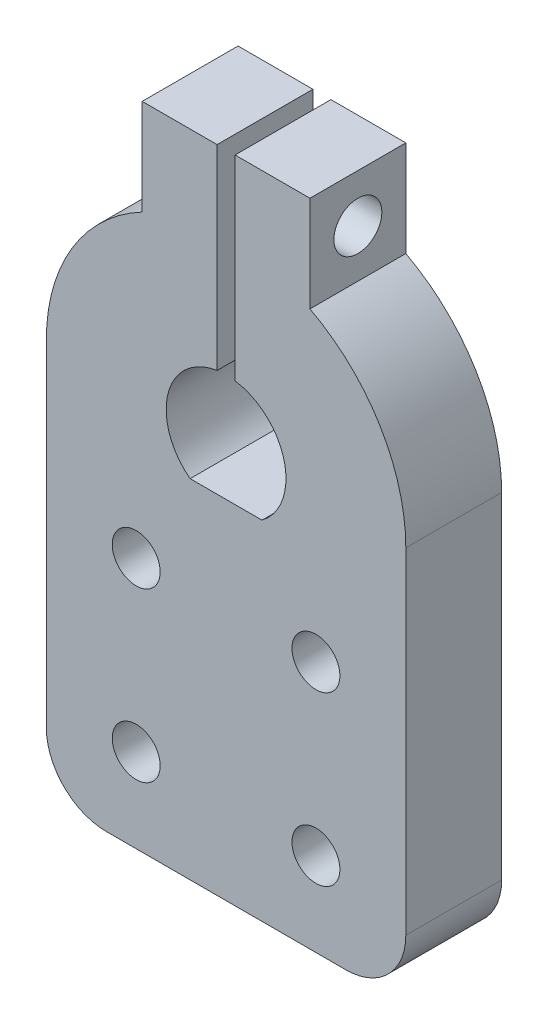
ISO-10303-21;
HEADER;
FILE_DESCRIPTION(('STEP AP214'),'2;1');
FILE_NAME('part.step','',(''),(''),'','','');
FILE_SCHEMA(('AUTOMOTIVE_DESIGN { 1 0 10303 214 1 1 1 1 }'));
ENDSEC;
DATA;
#1=APPLICATION_CONTEXT('core data for automotive mechanical design processes');
#2=APPLICATION_PROTOCOL_DEFINITION('international standard','automotive_design',2000,#1);
#3=PRODUCT_CONTEXT('',#1,'mechanical');
#4=PRODUCT('Part','Part','',(#3));
#5=PRODUCT_RELATED_PRODUCT_CATEGORY('part','',(#4));
#6=PRODUCT_DEFINITION_FORMATION('','',#4);
#7=PRODUCT_DEFINITION_CONTEXT('part definition',#1,'design');
#8=PRODUCT_DEFINITION('design','',#6,#7);
#9=PRODUCT_DEFINITION_SHAPE('','',#8);
#10=(LENGTH_UNIT() NAMED_UNIT(*) SI_UNIT(.MILLI.,.METRE.));
#11=(NAMED_UNIT(*) PLANE_ANGLE_UNIT() SI_UNIT($,.RADIAN.));
#12=(NAMED_UNIT(*) SI_UNIT($,.STERADIAN.) SOLID_ANGLE_UNIT());
#13=UNCERTAINTY_MEASURE_WITH_UNIT(LENGTH_MEASURE(1.E-05),#10,'distance_accuracy_value','');
#14=(GEOMETRIC_REPRESENTATION_CONTEXT(3) GLOBAL_UNCERTAINTY_ASSIGNED_CONTEXT((#13)) GLOBAL_UNIT_ASSIGNED_CONTEXT((#10,
#11,#12)) REPRESENTATION_CONTEXT('',''));
#15=CARTESIAN_POINT('',(0.,0.,0.));
#16=DIRECTION('',(0.,0.,1.));
#17=DIRECTION('',(1.,0.,0.));
#18=AXIS2_PLACEMENT_3D('',#15,#16,#17);
#19=CARTESIAN_POINT('',(0.,0.,8.));
#20=DIRECTION('',(0.,0.,1.));
#21=DIRECTION('',(1.,0.,0.));
#22=AXIS2_PLACEMENT_3D('',#19,#20,#21);
#23=PLANE('',#22);
#24=CARTESIAN_POINT('',(7.49999999999999,-26.,8.));
#25=DIRECTION('',(0.,0.,1.));
#26=DIRECTION('',(-1.,0.,0.));
#27=AXIS2_PLACEMENT_3D('',#24,#25,#26);
#28=CIRCLE('',#27,2.);
#29=CARTESIAN_POINT('',(5.5,-26.,8.));
#30=VERTEX_POINT('',#29);
#31=EDGE_CURVE('E549',#30,#30,#28,.T.);
#32=ORIENTED_EDGE('',*,*,#31,.F.);
#33=EDGE_LOOP('',(#32));
#34=FACE_BOUND('',#33,.T.);
#35=CARTESIAN_POINT('',(-7.5,-12.,8.));
#36=DIRECTION('',(0.,0.,1.));
#37=DIRECTION('',(1.,0.,0.));
#38=AXIS2_PLACEMENT_3D('',#35,#36,#37);
#39=CIRCLE('',#38,2.);
#40=CARTESIAN_POINT('',(-5.5,-12.,8.));
#41=VERTEX_POINT('',#40);
#42=EDGE_CURVE('E298',#41,#41,#39,.T.);
#43=ORIENTED_EDGE('',*,*,#42,.F.);
#44=EDGE_LOOP('',(#43));
#45=FACE_BOUND('',#44,.T.);
#46=DIRECTION('',(0.,-1.,0.));
#47=VECTOR('',#46,1.);
#48=CARTESIAN_POINT('',(-15.,0.,8.));
#49=LINE('',#48,#47);
#50=CARTESIAN_POINT('',(-15.,0.,8.));
#51=VERTEX_POINT('',#50);
#52=CARTESIAN_POINT('',(-15.,-28.,8.));
#53=VERTEX_POINT('',#52);
#54=EDGE_CURVE('E195',#51,#53,#49,.T.);
#55=ORIENTED_EDGE('',*,*,#54,.T.);
#56=CARTESIAN_POINT('',(-10.,-28.,8.));
#57=DIRECTION('',(0.,0.,1.));
#58=DIRECTION('',(1.,0.,0.));
#59=AXIS2_PLACEMENT_3D('',#56,#57,#58);
#60=CIRCLE('',#59,5.);
#61=CARTESIAN_POINT('',(-10.,-33.,8.));
#62=VERTEX_POINT('',#61);
#63=EDGE_CURVE('E45',#53,#62,#60,.T.);
#64=ORIENTED_EDGE('',*,*,#63,.T.);
#65=DIRECTION('',(1.,0.,0.));
#66=VECTOR('',#65,1.);
#67=CARTESIAN_POINT('',(-15.,-33.,8.));
#68=LINE('',#67,#66);
#69=CARTESIAN_POINT('',(9.99999999999999,-33.,8.));
#70=VERTEX_POINT('',#69);
#71=EDGE_CURVE('E194',#62,#70,#68,.T.);
#72=ORIENTED_EDGE('',*,*,#71,.T.);
#73=CARTESIAN_POINT('',(10.,-28.,8.));
#74=DIRECTION('',(0.,0.,1.));
#75=DIRECTION('',(1.,0.,0.));
#76=AXIS2_PLACEMENT_3D('',#73,#74,#75);
#77=CIRCLE('',#76,5.);
#78=CARTESIAN_POINT('',(15.,-28.,8.));
#79=VERTEX_POINT('',#78);
#80=EDGE_CURVE('E52',#70,#79,#77,.T.);
#81=ORIENTED_EDGE('',*,*,#80,.T.);
#82=DIRECTION('',(0.,1.,0.));
#83=VECTOR('',#82,1.);
#84=CARTESIAN_POINT('',(15.,-33.,8.));
#85=LINE('',#84,#83);
#86=CARTESIAN_POINT('',(15.,0.,8.));
#87=VERTEX_POINT('',#86);
#88=EDGE_CURVE('E203',#79,#87,#85,.T.);
#89=ORIENTED_EDGE('',*,*,#88,.T.);
#90=CARTESIAN_POINT('',(0.,0.,8.));
#91=DIRECTION('',(0.,0.,1.));
#92=DIRECTION('',(1.,0.,0.));
#93=AXIS2_PLACEMENT_3D('',#90,#91,#92);
#94=CIRCLE('',#93,15.);
#95=CARTESIAN_POINT('',(7.,13.2664991614216,8.));
#96=VERTEX_POINT('',#95);
#97=EDGE_CURVE('E295',#87,#96,#94,.T.);
#98=ORIENTED_EDGE('',*,*,#97,.T.);
#99=DIRECTION('',(0.,1.,0.));
#100=VECTOR('',#99,1.);
#101=CARTESIAN_POINT('',(7.,21.2664991614216,8.));
#102=LINE('',#101,#100);
#103=CARTESIAN_POINT('',(7.,21.2664991614216,8.));
#104=VERTEX_POINT('',#103);
#105=EDGE_CURVE('E168',#96,#104,#102,.T.);
#106=ORIENTED_EDGE('',*,*,#105,.T.);
#107=DIRECTION('',(-1.,0.,0.));
#108=VECTOR('',#107,1.);
#109=CARTESIAN_POINT('',(7.,21.2664991614216,8.));
#110=LINE('',#109,#108);
#111=CARTESIAN_POINT('',(0.750000000000002,21.2664991614216,8.));
#112=VERTEX_POINT('',#111);
#113=EDGE_CURVE('E163',#104,#112,#110,.T.);
#114=ORIENTED_EDGE('',*,*,#113,.T.);
#115=DIRECTION('',(0.,-1.,0.));
#116=VECTOR('',#115,1.);
#117=CARTESIAN_POINT('',(0.750000000000002,21.2664991614216,8.));
#118=LINE('',#117,#116);
#119=CARTESIAN_POINT('',(0.750000000000002,4.9434299833213,8.));
#120=VERTEX_POINT('',#119);
#121=EDGE_CURVE('E153',#112,#120,#118,.T.);
#122=ORIENTED_EDGE('',*,*,#121,.T.);
#123=CARTESIAN_POINT('',(0.,0.,8.));
#124=DIRECTION('',(0.,0.,-1.));
#125=DIRECTION('',(1.,0.,0.));
#126=AXIS2_PLACEMENT_3D('',#123,#124,#125);
#127=CIRCLE('',#126,5.);
#128=CARTESIAN_POINT('',(3.,-4.,8.));
#129=VERTEX_POINT('',#128);
#130=EDGE_CURVE('E162',#120,#129,#127,.T.);
#131=ORIENTED_EDGE('',*,*,#130,.T.);
#132=DIRECTION('',(-1.,0.,0.));
#133=VECTOR('',#132,1.);
#134=CARTESIAN_POINT('',(3.,-4.,8.));
#135=LINE('',#134,#133);
#136=CARTESIAN_POINT('',(-3.,-4.,8.));
#137=VERTEX_POINT('',#136);
#138=EDGE_CURVE('E260',#129,#137,#135,.T.);
#139=ORIENTED_EDGE('',*,*,#138,.T.);
#140=CARTESIAN_POINT('',(0.,0.,8.));
#141=DIRECTION('',(0.,0.,-1.));
#142=DIRECTION('',(1.,0.,0.));
#143=AXIS2_PLACEMENT_3D('',#140,#141,#142);
#144=CIRCLE('',#143,5.);
#145=CARTESIAN_POINT('',(-0.75,4.9434299833213,8.));
#146=VERTEX_POINT('',#145);
#147=EDGE_CURVE('E301',#137,#146,#144,.T.);
#148=ORIENTED_EDGE('',*,*,#147,.T.);
#149=DIRECTION('',(0.,1.,0.));
#150=VECTOR('',#149,1.);
#151=CARTESIAN_POINT('',(-0.750000000000002,21.2664991614216,8.));
#152=LINE('',#151,#150);
#153=CARTESIAN_POINT('',(-0.750000000000002,21.2664991614216,8.));
#154=VERTEX_POINT('',#153);
#155=EDGE_CURVE('E305',#146,#154,#152,.T.);
#156=ORIENTED_EDGE('',*,*,#155,.T.);
#157=DIRECTION('',(-1.,0.,0.));
#158=VECTOR('',#157,1.);
#159=CARTESIAN_POINT('',(-7.,21.2664991614216,8.));
#160=LINE('',#159,#158);
#161=CARTESIAN_POINT('',(-7.,21.2664991614216,8.));
#162=VERTEX_POINT('',#161);
#163=EDGE_CURVE('E290',#154,#162,#160,.T.);
#164=ORIENTED_EDGE('',*,*,#163,.T.);
#165=DIRECTION('',(0.,-1.,0.));
#166=VECTOR('',#165,1.);
#167=CARTESIAN_POINT('',(-7.,21.2664991614216,8.));
#168=LINE('',#167,#166);
#169=CARTESIAN_POINT('',(-7.,13.2664991614216,8.));
#170=VERTEX_POINT('',#169);
#171=EDGE_CURVE('E287',#162,#170,#168,.T.);
#172=ORIENTED_EDGE('',*,*,#171,.T.);
#173=CARTESIAN_POINT('',(0.,0.,8.));
#174=DIRECTION('',(0.,0.,1.));
#175=DIRECTION('',(1.,0.,0.));
#176=AXIS2_PLACEMENT_3D('',#173,#174,#175);
#177=CIRCLE('',#176,15.);
#178=EDGE_CURVE('E286',#170,#51,#177,.T.);
#179=ORIENTED_EDGE('',*,*,#178,.T.);
#180=EDGE_LOOP('',(#55,#64,#72,#81,#89,#98,#106,#114,#122,#131,#139,#148,#156,#164,#172,#179));
#181=FACE_BOUND('',#180,.T.);
#182=CARTESIAN_POINT('',(-7.49999999999999,-26.,8.));
#183=DIRECTION('',(0.,0.,1.));
#184=DIRECTION('',(1.,0.,0.));
#185=AXIS2_PLACEMENT_3D('',#182,#183,#184);
#186=CIRCLE('',#185,2.);
#187=CARTESIAN_POINT('',(-5.5,-26.,8.));
#188=VERTEX_POINT('',#187);
#189=EDGE_CURVE('E555',#188,#188,#186,.T.);
#190=ORIENTED_EDGE('',*,*,#189,.F.);
#191=EDGE_LOOP('',(#190));
#192=FACE_BOUND('',#191,.T.);
#193=CARTESIAN_POINT('',(7.5,-12.,8.));
#194=DIRECTION('',(0.,0.,1.));
#195=DIRECTION('',(-1.,0.,0.));
#196=AXIS2_PLACEMENT_3D('',#193,#194,#195);
#197=CIRCLE('',#196,2.);
#198=CARTESIAN_POINT('',(5.5,-12.,8.));
#199=VERTEX_POINT('',#198);
#200=EDGE_CURVE('E539',#199,#199,#197,.T.);
#201=ORIENTED_EDGE('',*,*,#200,.F.);
#202=EDGE_LOOP('',(#201));
#203=FACE_BOUND('',#202,.T.);
#204=ADVANCED_FACE('F37',(#34,#45,#181,#192,#203),#23,.T.);
#205=CARTESIAN_POINT('',(0.,0.,0.));
#206=DIRECTION('',(0.,0.,1.));
#207=DIRECTION('',(1.,0.,0.));
#208=AXIS2_PLACEMENT_3D('',#205,#206,#207);
#209=PLANE('',#208);
#210=DIRECTION('',(1.,0.,0.));
#211=VECTOR('',#210,1.);
#212=CARTESIAN_POINT('',(-15.,-33.,0.));
#213=LINE('',#212,#211);
#214=CARTESIAN_POINT('',(-10.,-33.,0.));
#215=VERTEX_POINT('',#214);
#216=CARTESIAN_POINT('',(9.99999999999999,-33.,0.));
#217=VERTEX_POINT('',#216);
#218=EDGE_CURVE('E212',#215,#217,#213,.T.);
#219=ORIENTED_EDGE('',*,*,#218,.F.);
#220=CARTESIAN_POINT('',(-10.,-28.,0.));
#221=DIRECTION('',(0.,0.,1.));
#222=DIRECTION('',(1.,0.,0.));
#223=AXIS2_PLACEMENT_3D('',#220,#221,#222);
#224=CIRCLE('',#223,5.);
#225=CARTESIAN_POINT('',(-15.,-28.,0.));
#226=VERTEX_POINT('',#225);
#227=EDGE_CURVE('E189',#215,#226,#224,.F.);
#228=ORIENTED_EDGE('',*,*,#227,.T.);
#229=DIRECTION('',(0.,-1.,0.));
#230=VECTOR('',#229,1.);
#231=CARTESIAN_POINT('',(-15.,0.,0.));
#232=LINE('',#231,#230);
#233=CARTESIAN_POINT('',(-15.,0.,0.));
#234=VERTEX_POINT('',#233);
#235=EDGE_CURVE('E211',#234,#226,#232,.T.);
#236=ORIENTED_EDGE('',*,*,#235,.F.);
#237=CARTESIAN_POINT('',(0.,0.,0.));
#238=DIRECTION('',(0.,0.,1.));
#239=DIRECTION('',(1.,0.,0.));
#240=AXIS2_PLACEMENT_3D('',#237,#238,#239);
#241=CIRCLE('',#240,15.);
#242=CARTESIAN_POINT('',(-7.,13.2664991614216,0.));
#243=VERTEX_POINT('',#242);
#244=EDGE_CURVE('E217',#243,#234,#241,.T.);
#245=ORIENTED_EDGE('',*,*,#244,.F.);
#246=DIRECTION('',(0.,-1.,0.));
#247=VECTOR('',#246,1.);
#248=CARTESIAN_POINT('',(-7.,21.2664991614216,0.));
#249=LINE('',#248,#247);
#250=CARTESIAN_POINT('',(-7.,21.2664991614216,0.));
#251=VERTEX_POINT('',#250);
#252=EDGE_CURVE('E221',#251,#243,#249,.T.);
#253=ORIENTED_EDGE('',*,*,#252,.F.);
#254=DIRECTION('',(-1.,0.,0.));
#255=VECTOR('',#254,1.);
#256=CARTESIAN_POINT('',(-7.,21.2664991614216,0.));
#257=LINE('',#256,#255);
#258=CARTESIAN_POINT('',(-0.750000000000002,21.2664991614216,0.));
#259=VERTEX_POINT('',#258);
#260=EDGE_CURVE('E275',#259,#251,#257,.T.);
#261=ORIENTED_EDGE('',*,*,#260,.F.);
#262=DIRECTION('',(0.,1.,0.));
#263=VECTOR('',#262,1.);
#264=CARTESIAN_POINT('',(-0.750000000000002,21.2664991614216,0.));
#265=LINE('',#264,#263);
#266=CARTESIAN_POINT('',(-0.75,4.9434299833213,0.));
#267=VERTEX_POINT('',#266);
#268=EDGE_CURVE('E268',#267,#259,#265,.T.);
#269=ORIENTED_EDGE('',*,*,#268,.F.);
#270=CARTESIAN_POINT('',(0.,0.,0.));
#271=DIRECTION('',(0.,0.,-1.));
#272=DIRECTION('',(1.,0.,0.));
#273=AXIS2_PLACEMENT_3D('',#270,#271,#272);
#274=CIRCLE('',#273,5.);
#275=CARTESIAN_POINT('',(-3.,-4.,0.));
#276=VERTEX_POINT('',#275);
#277=EDGE_CURVE('E266',#276,#267,#274,.T.);
#278=ORIENTED_EDGE('',*,*,#277,.F.);
#279=DIRECTION('',(-1.,0.,0.));
#280=VECTOR('',#279,1.);
#281=CARTESIAN_POINT('',(3.,-4.,0.));
#282=LINE('',#281,#280);
#283=CARTESIAN_POINT('',(3.,-4.,0.));
#284=VERTEX_POINT('',#283);
#285=EDGE_CURVE('E259',#284,#276,#282,.T.);
#286=ORIENTED_EDGE('',*,*,#285,.F.);
#287=CARTESIAN_POINT('',(0.,0.,0.));
#288=DIRECTION('',(0.,0.,-1.));
#289=DIRECTION('',(1.,0.,0.));
#290=AXIS2_PLACEMENT_3D('',#287,#288,#289);
#291=CIRCLE('',#290,5.);
#292=CARTESIAN_POINT('',(0.750000000000002,4.9434299833213,0.));
#293=VERTEX_POINT('',#292);
#294=EDGE_CURVE('E264',#293,#284,#291,.T.);
#295=ORIENTED_EDGE('',*,*,#294,.F.);
#296=DIRECTION('',(0.,-1.,0.));
#297=VECTOR('',#296,1.);
#298=CARTESIAN_POINT('',(0.750000000000002,21.2664991614216,0.));
#299=LINE('',#298,#297);
#300=CARTESIAN_POINT('',(0.750000000000002,21.2664991614216,0.));
#301=VERTEX_POINT('',#300);
#302=EDGE_CURVE('E270',#301,#293,#299,.T.);
#303=ORIENTED_EDGE('',*,*,#302,.F.);
#304=DIRECTION('',(-1.,0.,0.));
#305=VECTOR('',#304,1.);
#306=CARTESIAN_POINT('',(7.,21.2664991614216,0.));
#307=LINE('',#306,#305);
#308=CARTESIAN_POINT('',(7.,21.2664991614216,0.));
#309=VERTEX_POINT('',#308);
#310=EDGE_CURVE('E176',#309,#301,#307,.T.);
#311=ORIENTED_EDGE('',*,*,#310,.F.);
#312=DIRECTION('',(0.,1.,0.));
#313=VECTOR('',#312,1.);
#314=CARTESIAN_POINT('',(7.,21.2664991614216,0.));
#315=LINE('',#314,#313);
#316=CARTESIAN_POINT('',(7.,13.2664991614216,0.));
#317=VERTEX_POINT('',#316);
#318=EDGE_CURVE('E172',#317,#309,#315,.T.);
#319=ORIENTED_EDGE('',*,*,#318,.F.);
#320=CARTESIAN_POINT('',(0.,0.,0.));
#321=DIRECTION('',(0.,0.,1.));
#322=DIRECTION('',(1.,0.,0.));
#323=AXIS2_PLACEMENT_3D('',#320,#321,#322);
#324=CIRCLE('',#323,15.);
#325=CARTESIAN_POINT('',(15.,0.,0.));
#326=VERTEX_POINT('',#325);
#327=EDGE_CURVE('E226',#326,#317,#324,.T.);
#328=ORIENTED_EDGE('',*,*,#327,.F.);
#329=DIRECTION('',(0.,1.,0.));
#330=VECTOR('',#329,1.);
#331=CARTESIAN_POINT('',(15.,-33.,0.));
#332=LINE('',#331,#330);
#333=CARTESIAN_POINT('',(15.,-28.,0.));
#334=VERTEX_POINT('',#333);
#335=EDGE_CURVE('E219',#334,#326,#332,.T.);
#336=ORIENTED_EDGE('',*,*,#335,.F.);
#337=CARTESIAN_POINT('',(10.,-28.,0.));
#338=DIRECTION('',(0.,0.,1.));
#339=DIRECTION('',(1.,0.,0.));
#340=AXIS2_PLACEMENT_3D('',#337,#338,#339);
#341=CIRCLE('',#340,5.);
#342=EDGE_CURVE('E187',#334,#217,#341,.F.);
#343=ORIENTED_EDGE('',*,*,#342,.T.);
#344=EDGE_LOOP('',(#219,#228,#236,#245,#253,#261,#269,#278,#286,#295,#303,#311,#319,#328,#336,#343));
#345=FACE_BOUND('',#344,.T.);
#346=CARTESIAN_POINT('',(-7.5,-12.,0.));
#347=DIRECTION('',(0.,0.,1.));
#348=DIRECTION('',(1.,0.,0.));
#349=AXIS2_PLACEMENT_3D('',#346,#347,#348);
#350=CIRCLE('',#349,2.);
#351=CARTESIAN_POINT('',(-5.5,-12.,0.));
#352=VERTEX_POINT('',#351);
#353=EDGE_CURVE('E558',#352,#352,#350,.T.);
#354=ORIENTED_EDGE('',*,*,#353,.T.);
#355=EDGE_LOOP('',(#354));
#356=FACE_BOUND('',#355,.T.);
#357=CARTESIAN_POINT('',(-7.49999999999999,-26.,0.));
#358=DIRECTION('',(0.,0.,1.));
#359=DIRECTION('',(1.,0.,0.));
#360=AXIS2_PLACEMENT_3D('',#357,#358,#359);
#361=CIRCLE('',#360,2.);
#362=CARTESIAN_POINT('',(-5.5,-26.,0.));
#363=VERTEX_POINT('',#362);
#364=EDGE_CURVE('E552',#363,#363,#361,.T.);
#365=ORIENTED_EDGE('',*,*,#364,.T.);
#366=EDGE_LOOP('',(#365));
#367=FACE_BOUND('',#366,.T.);
#368=CARTESIAN_POINT('',(7.49999999999999,-26.,0.));
#369=DIRECTION('',(0.,0.,1.));
#370=DIRECTION('',(-1.,0.,0.));
#371=AXIS2_PLACEMENT_3D('',#368,#369,#370);
#372=CIRCLE('',#371,2.);
#373=CARTESIAN_POINT('',(5.5,-26.,0.));
#374=VERTEX_POINT('',#373);
#375=EDGE_CURVE('E547',#374,#374,#372,.T.);
#376=ORIENTED_EDGE('',*,*,#375,.T.);
#377=EDGE_LOOP('',(#376));
#378=FACE_BOUND('',#377,.T.);
#379=CARTESIAN_POINT('',(7.5,-12.,0.));
#380=DIRECTION('',(0.,0.,1.));
#381=DIRECTION('',(-1.,0.,0.));
#382=AXIS2_PLACEMENT_3D('',#379,#380,#381);
#383=CIRCLE('',#382,2.);
#384=CARTESIAN_POINT('',(5.5,-12.,0.));
#385=VERTEX_POINT('',#384);
#386=EDGE_CURVE('E535',#385,#385,#383,.T.);
#387=ORIENTED_EDGE('',*,*,#386,.T.);
#388=EDGE_LOOP('',(#387));
#389=FACE_BOUND('',#388,.T.);
#390=ADVANCED_FACE('F208',(#345,#356,#367,#378,#389),#209,.F.);
#391=CARTESIAN_POINT('',(7.,21.2664991614216,8.));
#392=DIRECTION('',(0.,-1.,0.));
#393=DIRECTION('',(0.,0.,-1.));
#394=AXIS2_PLACEMENT_3D('',#391,#392,#393);
#395=PLANE('',#394);
#396=ORIENTED_EDGE('',*,*,#310,.T.);
#397=DIRECTION('',(0.,0.,-1.));
#398=VECTOR('',#397,1.);
#399=CARTESIAN_POINT('',(0.750000000000002,21.2664991614216,8.));
#400=LINE('',#399,#398);
#401=EDGE_CURVE('E157',#112,#301,#400,.T.);
#402=ORIENTED_EDGE('',*,*,#401,.F.);
#403=ORIENTED_EDGE('',*,*,#113,.F.);
#404=DIRECTION('',(0.,0.,-1.));
#405=VECTOR('',#404,1.);
#406=CARTESIAN_POINT('',(7.,21.2664991614216,8.));
#407=LINE('',#406,#405);
#408=EDGE_CURVE('E229',#104,#309,#407,.T.);
#409=ORIENTED_EDGE('',*,*,#408,.T.);
#410=EDGE_LOOP('',(#396,#402,#403,#409));
#411=FACE_BOUND('',#410,.T.);
#412=ADVANCED_FACE('F174',(#411),#395,.F.);
#413=CARTESIAN_POINT('',(0.750000000000002,21.2664991614216,8.));
#414=DIRECTION('',(1.,0.,0.));
#415=DIRECTION('',(0.,1.,0.));
#416=AXIS2_PLACEMENT_3D('',#413,#414,#415);
#417=PLANE('',#416);
#418=CARTESIAN_POINT('',(0.750000000000002,17.2664991614216,4.));
#419=DIRECTION('',(1.,0.,0.));
#420=DIRECTION('',(0.,1.,0.));
#421=AXIS2_PLACEMENT_3D('',#418,#419,#420);
#422=CIRCLE('',#421,2.);
#423=CARTESIAN_POINT('',(0.750000000000003,19.2664991614216,4.));
#424=VERTEX_POINT('',#423);
#425=EDGE_CURVE('E533',#424,#424,#422,.T.);
#426=ORIENTED_EDGE('',*,*,#425,.T.);
#427=EDGE_LOOP('',(#426));
#428=FACE_BOUND('',#427,.T.);
#429=ORIENTED_EDGE('',*,*,#302,.T.);
#430=DIRECTION('',(0.,0.,-1.));
#431=VECTOR('',#430,1.);
#432=CARTESIAN_POINT('',(0.750000000000002,4.9434299833213,8.));
#433=LINE('',#432,#431);
#434=EDGE_CURVE('E160',#120,#293,#433,.T.);
#435=ORIENTED_EDGE('',*,*,#434,.F.);
#436=ORIENTED_EDGE('',*,*,#121,.F.);
#437=ORIENTED_EDGE('',*,*,#401,.T.);
#438=EDGE_LOOP('',(#429,#435,#436,#437));
#439=FACE_BOUND('',#438,.T.);
#440=ADVANCED_FACE('F155',(#428,#439),#417,.F.);
#441=CARTESIAN_POINT('',(0.,0.,8.));
#442=DIRECTION('',(0.,0.,-1.));
#443=DIRECTION('',(-1.,0.,0.));
#444=AXIS2_PLACEMENT_3D('',#441,#442,#443);
#445=CYLINDRICAL_SURFACE('',#444,5.);
#446=ORIENTED_EDGE('',*,*,#294,.T.);
#447=DIRECTION('',(0.,0.,-1.));
#448=VECTOR('',#447,1.);
#449=CARTESIAN_POINT('',(3.,-4.,8.));
#450=LINE('',#449,#448);
#451=EDGE_CURVE('E181',#129,#284,#450,.T.);
#452=ORIENTED_EDGE('',*,*,#451,.F.);
#453=ORIENTED_EDGE('',*,*,#130,.F.);
#454=ORIENTED_EDGE('',*,*,#434,.T.);
#455=EDGE_LOOP('',(#446,#452,#453,#454));
#456=FACE_BOUND('',#455,.T.);
#457=ADVANCED_FACE('F299',(#456),#445,.F.);
#458=CARTESIAN_POINT('',(3.,-4.,8.));
#459=DIRECTION('',(0.,-1.,0.));
#460=DIRECTION('',(0.,0.,-1.));
#461=AXIS2_PLACEMENT_3D('',#458,#459,#460);
#462=PLANE('',#461);
#463=ORIENTED_EDGE('',*,*,#285,.T.);
#464=DIRECTION('',(0.,0.,-1.));
#465=VECTOR('',#464,1.);
#466=CARTESIAN_POINT('',(-3.,-4.,8.));
#467=LINE('',#466,#465);
#468=EDGE_CURVE('E250',#137,#276,#467,.T.);
#469=ORIENTED_EDGE('',*,*,#468,.F.);
#470=ORIENTED_EDGE('',*,*,#138,.F.);
#471=ORIENTED_EDGE('',*,*,#451,.T.);
#472=EDGE_LOOP('',(#463,#469,#470,#471));
#473=FACE_BOUND('',#472,.T.);
#474=ADVANCED_FACE('F257',(#473),#462,.F.);
#475=CARTESIAN_POINT('',(0.,0.,8.));
#476=DIRECTION('',(0.,0.,-1.));
#477=DIRECTION('',(-1.,0.,0.));
#478=AXIS2_PLACEMENT_3D('',#475,#476,#477);
#479=CYLINDRICAL_SURFACE('',#478,5.);
#480=ORIENTED_EDGE('',*,*,#277,.T.);
#481=DIRECTION('',(0.,0.,-1.));
#482=VECTOR('',#481,1.);
#483=CARTESIAN_POINT('',(-0.75,4.9434299833213,8.));
#484=LINE('',#483,#482);
#485=EDGE_CURVE('E247',#146,#267,#484,.T.);
#486=ORIENTED_EDGE('',*,*,#485,.F.);
#487=ORIENTED_EDGE('',*,*,#147,.F.);
#488=ORIENTED_EDGE('',*,*,#468,.T.);
#489=EDGE_LOOP('',(#480,#486,#487,#488));
#490=FACE_BOUND('',#489,.T.);
#491=ADVANCED_FACE('F316',(#490),#479,.F.);
#492=CARTESIAN_POINT('',(-0.750000000000002,21.2664991614216,8.));
#493=DIRECTION('',(-1.,0.,0.));
#494=DIRECTION('',(0.,-1.,0.));
#495=AXIS2_PLACEMENT_3D('',#492,#493,#494);
#496=PLANE('',#495);
#497=CARTESIAN_POINT('',(-0.750000000000002,17.2664991614216,4.));
#498=DIRECTION('',(-1.,0.,0.));
#499=DIRECTION('',(0.,-1.,0.));
#500=AXIS2_PLACEMENT_3D('',#497,#498,#499);
#501=CIRCLE('',#500,2.);
#502=CARTESIAN_POINT('',(-0.750000000000001,15.2664991614216,4.));
#503=VERTEX_POINT('',#502);
#504=EDGE_CURVE('E536',#503,#503,#501,.T.);
#505=ORIENTED_EDGE('',*,*,#504,.T.);
#506=EDGE_LOOP('',(#505));
#507=FACE_BOUND('',#506,.T.);
#508=ORIENTED_EDGE('',*,*,#268,.T.);
#509=DIRECTION('',(0.,0.,-1.));
#510=VECTOR('',#509,1.);
#511=CARTESIAN_POINT('',(-0.750000000000002,21.2664991614216,8.));
#512=LINE('',#511,#510);
#513=EDGE_CURVE('E244',#154,#259,#512,.T.);
#514=ORIENTED_EDGE('',*,*,#513,.F.);
#515=ORIENTED_EDGE('',*,*,#155,.F.);
#516=ORIENTED_EDGE('',*,*,#485,.T.);
#517=EDGE_LOOP('',(#508,#514,#515,#516));
#518=FACE_BOUND('',#517,.T.);
#519=ADVANCED_FACE('F312',(#507,#518),#496,.F.);
#520=CARTESIAN_POINT('',(-7.,21.2664991614216,8.));
#521=DIRECTION('',(0.,-1.,0.));
#522=DIRECTION('',(0.,0.,-1.));
#523=AXIS2_PLACEMENT_3D('',#520,#521,#522);
#524=PLANE('',#523);
#525=ORIENTED_EDGE('',*,*,#260,.T.);
#526=DIRECTION('',(0.,0.,-1.));
#527=VECTOR('',#526,1.);
#528=CARTESIAN_POINT('',(-7.,21.2664991614216,8.));
#529=LINE('',#528,#527);
#530=EDGE_CURVE('E241',#162,#251,#529,.T.);
#531=ORIENTED_EDGE('',*,*,#530,.F.);
#532=ORIENTED_EDGE('',*,*,#163,.F.);
#533=ORIENTED_EDGE('',*,*,#513,.T.);
#534=EDGE_LOOP('',(#525,#531,#532,#533));
#535=FACE_BOUND('',#534,.T.);
#536=ADVANCED_FACE('F310',(#535),#524,.F.);
#537=CARTESIAN_POINT('',(-7.,21.2664991614216,8.));
#538=DIRECTION('',(1.,0.,0.));
#539=DIRECTION('',(0.,1.,0.));
#540=AXIS2_PLACEMENT_3D('',#537,#538,#539);
#541=PLANE('',#540);
#542=CARTESIAN_POINT('',(-7.,17.2664991614216,4.));
#543=DIRECTION('',(1.,0.,0.));
#544=DIRECTION('',(0.,1.,0.));
#545=AXIS2_PLACEMENT_3D('',#542,#543,#544);
#546=CIRCLE('',#545,2.);
#547=CARTESIAN_POINT('',(-7.,19.2664991614216,4.));
#548=VERTEX_POINT('',#547);
#549=EDGE_CURVE('E542',#548,#548,#546,.T.);
#550=ORIENTED_EDGE('',*,*,#549,.T.);
#551=EDGE_LOOP('',(#550));
#552=FACE_BOUND('',#551,.T.);
#553=ORIENTED_EDGE('',*,*,#252,.T.);
#554=DIRECTION('',(0.,0.,-1.));
#555=VECTOR('',#554,1.);
#556=CARTESIAN_POINT('',(-7.,13.2664991614216,8.));
#557=LINE('',#556,#555);
#558=EDGE_CURVE('E238',#170,#243,#557,.T.);
#559=ORIENTED_EDGE('',*,*,#558,.F.);
#560=ORIENTED_EDGE('',*,*,#171,.F.);
#561=ORIENTED_EDGE('',*,*,#530,.T.);
#562=EDGE_LOOP('',(#553,#559,#560,#561));
#563=FACE_BOUND('',#562,.T.);
#564=ADVANCED_FACE('F279',(#552,#563),#541,.F.);
#565=CARTESIAN_POINT('',(0.,0.,8.));
#566=DIRECTION('',(0.,0.,-1.));
#567=DIRECTION('',(-1.,0.,0.));
#568=AXIS2_PLACEMENT_3D('',#565,#566,#567);
#569=CYLINDRICAL_SURFACE('',#568,15.);
#570=ORIENTED_EDGE('',*,*,#244,.T.);
#571=DIRECTION('',(0.,0.,-1.));
#572=VECTOR('',#571,1.);
#573=CARTESIAN_POINT('',(-15.,0.,8.));
#574=LINE('',#573,#572);
#575=EDGE_CURVE('E216',#51,#234,#574,.T.);
#576=ORIENTED_EDGE('',*,*,#575,.F.);
#577=ORIENTED_EDGE('',*,*,#178,.F.);
#578=ORIENTED_EDGE('',*,*,#558,.T.);
#579=EDGE_LOOP('',(#570,#576,#577,#578));
#580=FACE_BOUND('',#579,.T.);
#581=ADVANCED_FACE('F285',(#580),#569,.T.);
#582=CARTESIAN_POINT('',(-15.,0.,8.));
#583=DIRECTION('',(1.,0.,0.));
#584=DIRECTION('',(0.,1.,0.));
#585=AXIS2_PLACEMENT_3D('',#582,#583,#584);
#586=PLANE('',#585);
#587=ORIENTED_EDGE('',*,*,#235,.T.);
#588=DIRECTION('',(0.,0.,-1.));
#589=VECTOR('',#588,1.);
#590=CARTESIAN_POINT('',(-15.,-28.,8.));
#591=LINE('',#590,#589);
#592=EDGE_CURVE('E60',#226,#53,#591,.F.);
#593=ORIENTED_EDGE('',*,*,#592,.T.);
#594=ORIENTED_EDGE('',*,*,#54,.F.);
#595=ORIENTED_EDGE('',*,*,#575,.T.);
#596=EDGE_LOOP('',(#587,#593,#594,#595));
#597=FACE_BOUND('',#596,.T.);
#598=ADVANCED_FACE('F214',(#597),#586,.F.);
#599=CARTESIAN_POINT('',(-15.,-33.,8.));
#600=DIRECTION('',(0.,1.,0.));
#601=DIRECTION('',(0.,0.,1.));
#602=AXIS2_PLACEMENT_3D('',#599,#600,#601);
#603=PLANE('',#602);
#604=ORIENTED_EDGE('',*,*,#71,.F.);
#605=DIRECTION('',(0.,0.,-1.));
#606=VECTOR('',#605,1.);
#607=CARTESIAN_POINT('',(-10.,-33.,8.));
#608=LINE('',#607,#606);
#609=EDGE_CURVE('E179',#62,#215,#608,.T.);
#610=ORIENTED_EDGE('',*,*,#609,.T.);
#611=ORIENTED_EDGE('',*,*,#218,.T.);
#612=DIRECTION('',(0.,0.,-1.));
#613=VECTOR('',#612,1.);
#614=CARTESIAN_POINT('',(10.,-33.,8.));
#615=LINE('',#614,#613);
#616=EDGE_CURVE('E177',#217,#70,#615,.F.);
#617=ORIENTED_EDGE('',*,*,#616,.T.);
#618=EDGE_LOOP('',(#604,#610,#611,#617));
#619=FACE_BOUND('',#618,.T.);
#620=ADVANCED_FACE('F199',(#619),#603,.F.);
#621=CARTESIAN_POINT('',(15.,-33.,8.));
#622=DIRECTION('',(-1.,0.,0.));
#623=DIRECTION('',(0.,-1.,0.));
#624=AXIS2_PLACEMENT_3D('',#621,#622,#623);
#625=PLANE('',#624);
#626=ORIENTED_EDGE('',*,*,#88,.F.);
#627=DIRECTION('',(0.,0.,-1.));
#628=VECTOR('',#627,1.);
#629=CARTESIAN_POINT('',(15.,-28.,8.));
#630=LINE('',#629,#628);
#631=EDGE_CURVE('E11',#79,#334,#630,.T.);
#632=ORIENTED_EDGE('',*,*,#631,.T.);
#633=ORIENTED_EDGE('',*,*,#335,.T.);
#634=DIRECTION('',(0.,0.,-1.));
#635=VECTOR('',#634,1.);
#636=CARTESIAN_POINT('',(15.,0.,8.));
#637=LINE('',#636,#635);
#638=EDGE_CURVE('E234',#87,#326,#637,.T.);
#639=ORIENTED_EDGE('',*,*,#638,.F.);
#640=EDGE_LOOP('',(#626,#632,#633,#639));
#641=FACE_BOUND('',#640,.T.);
#642=ADVANCED_FACE('F346',(#641),#625,.F.);
#643=CARTESIAN_POINT('',(0.,0.,8.));
#644=DIRECTION('',(0.,0.,-1.));
#645=DIRECTION('',(-1.,0.,0.));
#646=AXIS2_PLACEMENT_3D('',#643,#644,#645);
#647=CYLINDRICAL_SURFACE('',#646,15.);
#648=ORIENTED_EDGE('',*,*,#327,.T.);
#649=DIRECTION('',(0.,0.,-1.));
#650=VECTOR('',#649,1.);
#651=CARTESIAN_POINT('',(7.,13.2664991614216,8.));
#652=LINE('',#651,#650);
#653=EDGE_CURVE('E231',#96,#317,#652,.T.);
#654=ORIENTED_EDGE('',*,*,#653,.F.);
#655=ORIENTED_EDGE('',*,*,#97,.F.);
#656=ORIENTED_EDGE('',*,*,#638,.T.);
#657=EDGE_LOOP('',(#648,#654,#655,#656));
#658=FACE_BOUND('',#657,.T.);
#659=ADVANCED_FACE('F342',(#658),#647,.T.);
#660=CARTESIAN_POINT('',(7.,21.2664991614216,8.));
#661=DIRECTION('',(-1.,0.,0.));
#662=DIRECTION('',(0.,-1.,0.));
#663=AXIS2_PLACEMENT_3D('',#660,#661,#662);
#664=PLANE('',#663);
#665=CARTESIAN_POINT('',(7.,17.2664991614216,4.));
#666=DIRECTION('',(1.,0.,0.));
#667=DIRECTION('',(0.,0.,-1.));
#668=AXIS2_PLACEMENT_3D('',#665,#666,#667);
#669=CIRCLE('',#668,2.);
#670=CARTESIAN_POINT('',(7.,17.2664991614216,2.));
#671=VERTEX_POINT('',#670);
#672=EDGE_CURVE('E581',#671,#671,#669,.T.);
#673=ORIENTED_EDGE('',*,*,#672,.F.);
#674=EDGE_LOOP('',(#673));
#675=FACE_BOUND('',#674,.T.);
#676=ORIENTED_EDGE('',*,*,#318,.T.);
#677=ORIENTED_EDGE('',*,*,#408,.F.);
#678=ORIENTED_EDGE('',*,*,#105,.F.);
#679=ORIENTED_EDGE('',*,*,#653,.T.);
#680=EDGE_LOOP('',(#676,#677,#678,#679));
#681=FACE_BOUND('',#680,.T.);
#682=ADVANCED_FACE('F339',(#675,#681),#664,.F.);
#683=CARTESIAN_POINT('',(-7.5,-12.,8.));
#684=DIRECTION('',(0.,0.,-1.));
#685=DIRECTION('',(-1.,0.,0.));
#686=AXIS2_PLACEMENT_3D('',#683,#684,#685);
#687=CYLINDRICAL_SURFACE('',#686,2.);
#688=ORIENTED_EDGE('',*,*,#42,.T.);
#689=EDGE_LOOP('',(#688));
#690=FACE_BOUND('',#689,.T.);
#691=ORIENTED_EDGE('',*,*,#353,.F.);
#692=EDGE_LOOP('',(#691));
#693=FACE_BOUND('',#692,.T.);
#694=ADVANCED_FACE('F336',(#690,#693),#687,.F.);
#695=CARTESIAN_POINT('',(-7.49999999999999,-26.,8.));
#696=DIRECTION('',(0.,0.,-1.));
#697=DIRECTION('',(-1.,0.,0.));
#698=AXIS2_PLACEMENT_3D('',#695,#696,#697);
#699=CYLINDRICAL_SURFACE('',#698,2.);
#700=ORIENTED_EDGE('',*,*,#189,.T.);
#701=EDGE_LOOP('',(#700));
#702=FACE_BOUND('',#701,.T.);
#703=ORIENTED_EDGE('',*,*,#364,.F.);
#704=EDGE_LOOP('',(#703));
#705=FACE_BOUND('',#704,.T.);
#706=ADVANCED_FACE('F402',(#702,#705),#699,.F.);
#707=CARTESIAN_POINT('',(7.49999999999999,-26.,8.));
#708=DIRECTION('',(0.,0.,-1.));
#709=DIRECTION('',(-1.,0.,0.));
#710=AXIS2_PLACEMENT_3D('',#707,#708,#709);
#711=CYLINDRICAL_SURFACE('',#710,2.);
#712=ORIENTED_EDGE('',*,*,#31,.T.);
#713=EDGE_LOOP('',(#712));
#714=FACE_BOUND('',#713,.T.);
#715=ORIENTED_EDGE('',*,*,#375,.F.);
#716=EDGE_LOOP('',(#715));
#717=FACE_BOUND('',#716,.T.);
#718=ADVANCED_FACE('F409',(#714,#717),#711,.F.);
#719=CARTESIAN_POINT('',(7.5,-12.,8.));
#720=DIRECTION('',(0.,0.,-1.));
#721=DIRECTION('',(-1.,0.,0.));
#722=AXIS2_PLACEMENT_3D('',#719,#720,#721);
#723=CYLINDRICAL_SURFACE('',#722,2.);
#724=ORIENTED_EDGE('',*,*,#200,.T.);
#725=EDGE_LOOP('',(#724));
#726=FACE_BOUND('',#725,.T.);
#727=ORIENTED_EDGE('',*,*,#386,.F.);
#728=EDGE_LOOP('',(#727));
#729=FACE_BOUND('',#728,.T.);
#730=ADVANCED_FACE('F416',(#726,#729),#723,.F.);
#731=CARTESIAN_POINT('',(-8.,17.2664991614216,4.));
#732=DIRECTION('',(1.,0.,0.));
#733=DIRECTION('',(0.,0.,-1.));
#734=AXIS2_PLACEMENT_3D('',#731,#732,#733);
#735=CYLINDRICAL_SURFACE('',#734,2.);
#736=ORIENTED_EDGE('',*,*,#672,.T.);
#737=EDGE_LOOP('',(#736));
#738=FACE_BOUND('',#737,.T.);
#739=ORIENTED_EDGE('',*,*,#425,.F.);
#740=EDGE_LOOP('',(#739));
#741=FACE_BOUND('',#740,.T.);
#742=ADVANCED_FACE('F424',(#738,#741),#735,.F.);
#743=ORIENTED_EDGE('',*,*,#549,.F.);
#744=EDGE_LOOP('',(#743));
#745=FACE_BOUND('',#744,.T.);
#746=ORIENTED_EDGE('',*,*,#504,.F.);
#747=EDGE_LOOP('',(#746));
#748=FACE_BOUND('',#747,.T.);
#749=ADVANCED_FACE('F432',(#745,#748),#735,.F.);
#750=CARTESIAN_POINT('',(-10.,-28.,8.));
#751=DIRECTION('',(0.,0.,-1.));
#752=DIRECTION('',(-1.,0.,0.));
#753=AXIS2_PLACEMENT_3D('',#750,#751,#752);
#754=CYLINDRICAL_SURFACE('',#753,5.);
#755=ORIENTED_EDGE('',*,*,#63,.F.);
#756=ORIENTED_EDGE('',*,*,#592,.F.);
#757=ORIENTED_EDGE('',*,*,#227,.F.);
#758=ORIENTED_EDGE('',*,*,#609,.F.);
#759=EDGE_LOOP('',(#755,#756,#757,#758));
#760=FACE_BOUND('',#759,.T.);
#761=ADVANCED_FACE('F205',(#760),#754,.T.);
#762=CARTESIAN_POINT('',(10.,-28.,8.));
#763=DIRECTION('',(0.,0.,-1.));
#764=DIRECTION('',(-1.,0.,0.));
#765=AXIS2_PLACEMENT_3D('',#762,#763,#764);
#766=CYLINDRICAL_SURFACE('',#765,5.);
#767=ORIENTED_EDGE('',*,*,#80,.F.);
#768=ORIENTED_EDGE('',*,*,#616,.F.);
#769=ORIENTED_EDGE('',*,*,#342,.F.);
#770=ORIENTED_EDGE('',*,*,#631,.F.);
#771=EDGE_LOOP('',(#767,#768,#769,#770));
#772=FACE_BOUND('',#771,.T.);
#773=ADVANCED_FACE('F39',(#772),#766,.T.);
#774=CLOSED_SHELL('',(#204,#390,#412,#440,#457,#474,#491,#519,#536,#564,#581,#598,#620,#642,
#659,#682,#694,#706,#718,#730,#742,#749,#761,#773));
#775=MANIFOLD_SOLID_BREP('B2',#774);
#776=ADVANCED_BREP_SHAPE_REPRESENTATION('',(#18,#775),#14);
#777=SHAPE_DEFINITION_REPRESENTATION(#9,#776);
ENDSEC;
END-ISO-10303-21;
